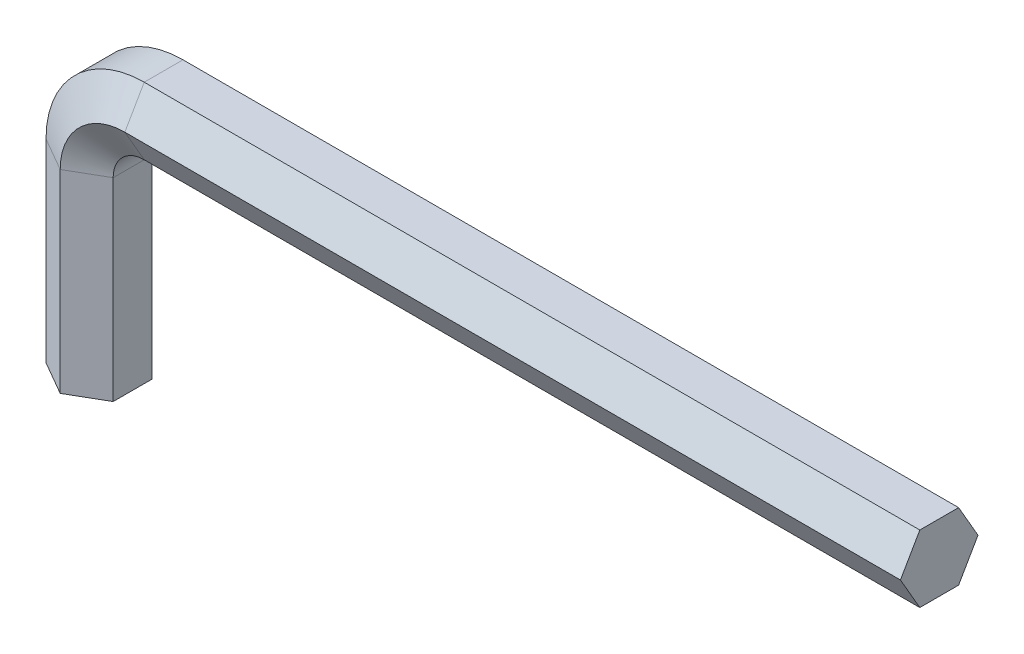
ISO-10303-21;
HEADER;
FILE_DESCRIPTION(('STEP AP214'),'2;1');
FILE_NAME('part.step','',(''),(''),'','','');
FILE_SCHEMA(('AUTOMOTIVE_DESIGN { 1 0 10303 214 1 1 1 1 }'));
ENDSEC;
DATA;
#1=APPLICATION_CONTEXT('core data for automotive mechanical design processes');
#2=APPLICATION_PROTOCOL_DEFINITION('international standard','automotive_design',2000,#1);
#3=PRODUCT_CONTEXT('',#1,'mechanical');
#4=PRODUCT('Part','Part','',(#3));
#5=PRODUCT_RELATED_PRODUCT_CATEGORY('part','',(#4));
#6=PRODUCT_DEFINITION_FORMATION('','',#4);
#7=PRODUCT_DEFINITION_CONTEXT('part definition',#1,'design');
#8=PRODUCT_DEFINITION('design','',#6,#7);
#9=PRODUCT_DEFINITION_SHAPE('','',#8);
#10=(LENGTH_UNIT() NAMED_UNIT(*) SI_UNIT(.MILLI.,.METRE.));
#11=(NAMED_UNIT(*) PLANE_ANGLE_UNIT() SI_UNIT($,.RADIAN.));
#12=(NAMED_UNIT(*) SI_UNIT($,.STERADIAN.) SOLID_ANGLE_UNIT());
#13=UNCERTAINTY_MEASURE_WITH_UNIT(LENGTH_MEASURE(1.E-05),#10,'distance_accuracy_value','');
#14=(GEOMETRIC_REPRESENTATION_CONTEXT(3) GLOBAL_UNCERTAINTY_ASSIGNED_CONTEXT((#13)) GLOBAL_UNIT_ASSIGNED_CONTEXT((#10,
#11,#12)) REPRESENTATION_CONTEXT('',''));
#15=CARTESIAN_POINT('',(0.,0.,0.));
#16=DIRECTION('',(0.,0.,1.));
#17=DIRECTION('',(1.,0.,0.));
#18=AXIS2_PLACEMENT_3D('',#15,#16,#17);
#19=CARTESIAN_POINT('',(65.,0.,0.));
#20=DIRECTION('',(-1.,0.,0.));
#21=DIRECTION('',(0.,0.,-1.));
#22=AXIS2_PLACEMENT_3D('',#19,#20,#21);
#23=PLANE('',#22);
#24=DIRECTION('',(0.,-0.866025403784442,-0.499999999999995));
#25=VECTOR('',#24,1.);
#26=CARTESIAN_POINT('',(65.,2.59807621135329,-1.50000000000003));
#27=LINE('',#26,#25);
#28=CARTESIAN_POINT('',(65.,2.59807621135329,-1.50000000000003));
#29=VERTEX_POINT('',#28);
#30=CARTESIAN_POINT('',(65.,0.,-2.99999999999999));
#31=VERTEX_POINT('',#30);
#32=EDGE_CURVE('E194',#29,#31,#27,.T.);
#33=ORIENTED_EDGE('',*,*,#32,.F.);
#34=DIRECTION('',(0.,0.,-1.));
#35=VECTOR('',#34,1.);
#36=CARTESIAN_POINT('',(65.,2.59807621135332,1.49999999999997));
#37=LINE('',#36,#35);
#38=CARTESIAN_POINT('',(65.,2.59807621135332,1.49999999999997));
#39=VERTEX_POINT('',#38);
#40=EDGE_CURVE('E256',#39,#29,#37,.T.);
#41=ORIENTED_EDGE('',*,*,#40,.F.);
#42=DIRECTION('',(0.,0.866025403784435,-0.500000000000007));
#43=VECTOR('',#42,1.);
#44=CARTESIAN_POINT('',(65.,0.,2.99999999999999));
#45=LINE('',#44,#43);
#46=CARTESIAN_POINT('',(65.,0.,2.99999999999999));
#47=VERTEX_POINT('',#46);
#48=EDGE_CURVE('E236',#47,#39,#45,.T.);
#49=ORIENTED_EDGE('',*,*,#48,.F.);
#50=DIRECTION('',(0.,0.866025403784442,0.499999999999995));
#51=VECTOR('',#50,1.);
#52=CARTESIAN_POINT('',(65.,-2.5980762113533,1.50000000000001));
#53=LINE('',#52,#51);
#54=CARTESIAN_POINT('',(65.,-2.5980762113533,1.50000000000001));
#55=VERTEX_POINT('',#54);
#56=EDGE_CURVE('E141',#55,#47,#53,.T.);
#57=ORIENTED_EDGE('',*,*,#56,.F.);
#58=DIRECTION('',(0.,0.,1.));
#59=VECTOR('',#58,1.);
#60=CARTESIAN_POINT('',(65.,-2.59807621135331,-1.49999999999999));
#61=LINE('',#60,#59);
#62=CARTESIAN_POINT('',(65.,-2.59807621135331,-1.49999999999999));
#63=VERTEX_POINT('',#62);
#64=EDGE_CURVE('E145',#63,#55,#61,.T.);
#65=ORIENTED_EDGE('',*,*,#64,.F.);
#66=DIRECTION('',(0.,-0.866025403784438,0.500000000000001));
#67=VECTOR('',#66,1.);
#68=CARTESIAN_POINT('',(65.,0.,-2.99999999999999));
#69=LINE('',#68,#67);
#70=EDGE_CURVE('E150',#31,#63,#69,.T.);
#71=ORIENTED_EDGE('',*,*,#70,.F.);
#72=EDGE_LOOP('',(#33,#41,#49,#57,#65,#71));
#73=FACE_BOUND('',#72,.T.);
#74=ADVANCED_FACE('F39',(#73),#23,.F.);
#75=CARTESIAN_POINT('',(0.,-20.,0.));
#76=DIRECTION('',(0.,-1.,0.));
#77=DIRECTION('',(0.,0.,-1.));
#78=AXIS2_PLACEMENT_3D('',#75,#76,#77);
#79=PLANE('',#78);
#80=DIRECTION('',(0.866025403784442,0.,-0.499999999999995));
#81=VECTOR('',#80,1.);
#82=CARTESIAN_POINT('',(-2.59807621135329,-20.,-1.50000000000003));
#83=LINE('',#82,#81);
#84=CARTESIAN_POINT('',(-2.59807621135329,-20.,-1.50000000000003));
#85=VERTEX_POINT('',#84);
#86=CARTESIAN_POINT('',(0.,-20.,-2.99999999999999));
#87=VERTEX_POINT('',#86);
#88=EDGE_CURVE('E161',#85,#87,#83,.T.);
#89=ORIENTED_EDGE('',*,*,#88,.T.);
#90=DIRECTION('',(0.866025403784438,0.,0.500000000000001));
#91=VECTOR('',#90,1.);
#92=CARTESIAN_POINT('',(0.,-20.,-2.99999999999999));
#93=LINE('',#92,#91);
#94=CARTESIAN_POINT('',(2.59807621135332,-20.,-1.49999999999999));
#95=VERTEX_POINT('',#94);
#96=EDGE_CURVE('E164',#87,#95,#93,.T.);
#97=ORIENTED_EDGE('',*,*,#96,.T.);
#98=DIRECTION('',(0.,0.,1.));
#99=VECTOR('',#98,1.);
#100=CARTESIAN_POINT('',(2.59807621135332,-20.,-1.49999999999999));
#101=LINE('',#100,#99);
#102=CARTESIAN_POINT('',(2.59807621135331,-20.,1.50000000000001));
#103=VERTEX_POINT('',#102);
#104=EDGE_CURVE('E214',#95,#103,#101,.T.);
#105=ORIENTED_EDGE('',*,*,#104,.T.);
#106=DIRECTION('',(-0.866025403784442,0.,0.499999999999995));
#107=VECTOR('',#106,1.);
#108=CARTESIAN_POINT('',(2.59807621135331,-20.,1.50000000000001));
#109=LINE('',#108,#107);
#110=CARTESIAN_POINT('',(0.,-20.,2.99999999999999));
#111=VERTEX_POINT('',#110);
#112=EDGE_CURVE('E59',#103,#111,#109,.T.);
#113=ORIENTED_EDGE('',*,*,#112,.T.);
#114=DIRECTION('',(-0.866025403784435,0.,-0.500000000000007));
#115=VECTOR('',#114,1.);
#116=CARTESIAN_POINT('',(0.,-20.,2.99999999999999));
#117=LINE('',#116,#115);
#118=CARTESIAN_POINT('',(-2.59807621135332,-20.,1.49999999999997));
#119=VERTEX_POINT('',#118);
#120=EDGE_CURVE('E53',#111,#119,#117,.T.);
#121=ORIENTED_EDGE('',*,*,#120,.T.);
#122=DIRECTION('',(0.,0.,-1.));
#123=VECTOR('',#122,1.);
#124=CARTESIAN_POINT('',(-2.59807621135332,-20.,1.49999999999997));
#125=LINE('',#124,#123);
#126=EDGE_CURVE('E11',#119,#85,#125,.T.);
#127=ORIENTED_EDGE('',*,*,#126,.T.);
#128=EDGE_LOOP('',(#89,#97,#105,#113,#121,#127));
#129=FACE_BOUND('',#128,.T.);
#130=ADVANCED_FACE('F163',(#129),#79,.T.);
#131=CARTESIAN_POINT('',(65.,2.59807621135329,-1.50000000000003));
#132=DIRECTION('',(0.,0.499999999999995,-0.866025403784442));
#133=DIRECTION('',(0.,0.866025403784442,0.499999999999995));
#134=AXIS2_PLACEMENT_3D('',#131,#132,#133);
#135=PLANE('',#134);
#136=DIRECTION('',(-1.,0.,0.));
#137=VECTOR('',#136,1.);
#138=CARTESIAN_POINT('',(65.,0.,-2.99999999999999));
#139=LINE('',#138,#137);
#140=CARTESIAN_POINT('',(5.00000000000003,0.,-2.99999999999999));
#141=VERTEX_POINT('',#140);
#142=EDGE_CURVE('E200',#31,#141,#139,.T.);
#143=ORIENTED_EDGE('',*,*,#142,.T.);
#144=DIRECTION('',(0.,-0.866025403784442,-0.499999999999995));
#145=VECTOR('',#144,1.);
#146=CARTESIAN_POINT('',(5.00000000000004,2.59807621135329,-1.50000000000003));
#147=LINE('',#146,#145);
#148=CARTESIAN_POINT('',(5.00000000000003,2.59807621135329,-1.50000000000003));
#149=VERTEX_POINT('',#148);
#150=EDGE_CURVE('E301',#149,#141,#147,.T.);
#151=ORIENTED_EDGE('',*,*,#150,.F.);
#152=DIRECTION('',(-1.,0.,0.));
#153=VECTOR('',#152,1.);
#154=CARTESIAN_POINT('',(65.,2.59807621135329,-1.50000000000003));
#155=LINE('',#154,#153);
#156=EDGE_CURVE('E277',#29,#149,#155,.T.);
#157=ORIENTED_EDGE('',*,*,#156,.F.);
#158=ORIENTED_EDGE('',*,*,#32,.T.);
#159=EDGE_LOOP('',(#143,#151,#157,#158));
#160=FACE_BOUND('',#159,.T.);
#161=ADVANCED_FACE('F311',(#160),#135,.T.);
#162=CARTESIAN_POINT('',(65.,0.,-2.99999999999999));
#163=DIRECTION('',(0.,-0.500000000000001,-0.866025403784438));
#164=DIRECTION('',(0.,0.866025403784438,-0.500000000000001));
#165=AXIS2_PLACEMENT_3D('',#162,#163,#164);
#166=PLANE('',#165);
#167=DIRECTION('',(-1.,0.,0.));
#168=VECTOR('',#167,1.);
#169=CARTESIAN_POINT('',(65.,-2.59807621135331,-1.49999999999999));
#170=LINE('',#169,#168);
#171=CARTESIAN_POINT('',(5.00000000000003,-2.59807621135331,-1.49999999999999));
#172=VERTEX_POINT('',#171);
#173=EDGE_CURVE('E199',#63,#172,#170,.T.);
#174=ORIENTED_EDGE('',*,*,#173,.T.);
#175=DIRECTION('',(0.,-0.866025403784438,0.500000000000001));
#176=VECTOR('',#175,1.);
#177=CARTESIAN_POINT('',(5.00000000000004,0.,-2.99999999999999));
#178=LINE('',#177,#176);
#179=EDGE_CURVE('E195',#141,#172,#178,.T.);
#180=ORIENTED_EDGE('',*,*,#179,.F.);
#181=ORIENTED_EDGE('',*,*,#142,.F.);
#182=ORIENTED_EDGE('',*,*,#70,.T.);
#183=EDGE_LOOP('',(#174,#180,#181,#182));
#184=FACE_BOUND('',#183,.T.);
#185=ADVANCED_FACE('F314',(#184),#166,.T.);
#186=CARTESIAN_POINT('',(65.,-2.59807621135331,-1.49999999999999));
#187=DIRECTION('',(0.,-1.,0.));
#188=DIRECTION('',(0.,0.,-1.));
#189=AXIS2_PLACEMENT_3D('',#186,#187,#188);
#190=PLANE('',#189);
#191=DIRECTION('',(-1.,0.,0.));
#192=VECTOR('',#191,1.);
#193=CARTESIAN_POINT('',(65.,-2.5980762113533,1.50000000000001));
#194=LINE('',#193,#192);
#195=CARTESIAN_POINT('',(5.00000000000003,-2.5980762113533,1.50000000000001));
#196=VERTEX_POINT('',#195);
#197=EDGE_CURVE('E219',#55,#196,#194,.T.);
#198=ORIENTED_EDGE('',*,*,#197,.T.);
#199=DIRECTION('',(0.,0.,1.));
#200=VECTOR('',#199,1.);
#201=CARTESIAN_POINT('',(5.00000000000004,-2.59807621135331,-1.49999999999999));
#202=LINE('',#201,#200);
#203=EDGE_CURVE('E204',#172,#196,#202,.T.);
#204=ORIENTED_EDGE('',*,*,#203,.F.);
#205=ORIENTED_EDGE('',*,*,#173,.F.);
#206=ORIENTED_EDGE('',*,*,#64,.T.);
#207=EDGE_LOOP('',(#198,#204,#205,#206));
#208=FACE_BOUND('',#207,.T.);
#209=ADVANCED_FACE('F368',(#208),#190,.T.);
#210=CARTESIAN_POINT('',(65.,-2.5980762113533,1.50000000000001));
#211=DIRECTION('',(0.,-0.499999999999995,0.866025403784441));
#212=DIRECTION('',(0.,-0.866025403784442,-0.499999999999995));
#213=AXIS2_PLACEMENT_3D('',#210,#211,#212);
#214=PLANE('',#213);
#215=DIRECTION('',(-1.,0.,0.));
#216=VECTOR('',#215,1.);
#217=CARTESIAN_POINT('',(65.,0.,2.99999999999999));
#218=LINE('',#217,#216);
#219=CARTESIAN_POINT('',(5.00000000000003,0.,2.99999999999999));
#220=VERTEX_POINT('',#219);
#221=EDGE_CURVE('E239',#47,#220,#218,.T.);
#222=ORIENTED_EDGE('',*,*,#221,.T.);
#223=DIRECTION('',(0.,0.866025403784442,0.499999999999995));
#224=VECTOR('',#223,1.);
#225=CARTESIAN_POINT('',(5.00000000000004,-2.5980762113533,1.50000000000001));
#226=LINE('',#225,#224);
#227=EDGE_CURVE('E223',#196,#220,#226,.T.);
#228=ORIENTED_EDGE('',*,*,#227,.F.);
#229=ORIENTED_EDGE('',*,*,#197,.F.);
#230=ORIENTED_EDGE('',*,*,#56,.T.);
#231=EDGE_LOOP('',(#222,#228,#229,#230));
#232=FACE_BOUND('',#231,.T.);
#233=ADVANCED_FACE('F376',(#232),#214,.T.);
#234=CARTESIAN_POINT('',(65.,0.,2.99999999999999));
#235=DIRECTION('',(0.,0.500000000000007,0.866025403784435));
#236=DIRECTION('',(0.,-0.866025403784435,0.500000000000007));
#237=AXIS2_PLACEMENT_3D('',#234,#235,#236);
#238=PLANE('',#237);
#239=DIRECTION('',(-1.,0.,0.));
#240=VECTOR('',#239,1.);
#241=CARTESIAN_POINT('',(65.,2.59807621135332,1.49999999999997));
#242=LINE('',#241,#240);
#243=CARTESIAN_POINT('',(5.00000000000003,2.59807621135332,1.49999999999997));
#244=VERTEX_POINT('',#243);
#245=EDGE_CURVE('E259',#39,#244,#242,.T.);
#246=ORIENTED_EDGE('',*,*,#245,.T.);
#247=DIRECTION('',(0.,0.866025403784435,-0.500000000000007));
#248=VECTOR('',#247,1.);
#249=CARTESIAN_POINT('',(5.00000000000004,0.,2.99999999999999));
#250=LINE('',#249,#248);
#251=EDGE_CURVE('E243',#220,#244,#250,.T.);
#252=ORIENTED_EDGE('',*,*,#251,.F.);
#253=ORIENTED_EDGE('',*,*,#221,.F.);
#254=ORIENTED_EDGE('',*,*,#48,.T.);
#255=EDGE_LOOP('',(#246,#252,#253,#254));
#256=FACE_BOUND('',#255,.T.);
#257=ADVANCED_FACE('F386',(#256),#238,.T.);
#258=CARTESIAN_POINT('',(65.,2.59807621135332,1.49999999999997));
#259=DIRECTION('',(0.,1.,0.));
#260=DIRECTION('',(0.,0.,1.));
#261=AXIS2_PLACEMENT_3D('',#258,#259,#260);
#262=PLANE('',#261);
#263=DIRECTION('',(0.,0.,-1.));
#264=VECTOR('',#263,1.);
#265=CARTESIAN_POINT('',(5.00000000000004,2.59807621135332,1.49999999999997));
#266=LINE('',#265,#264);
#267=EDGE_CURVE('E263',#244,#149,#266,.T.);
#268=ORIENTED_EDGE('',*,*,#267,.F.);
#269=ORIENTED_EDGE('',*,*,#245,.F.);
#270=ORIENTED_EDGE('',*,*,#40,.T.);
#271=ORIENTED_EDGE('',*,*,#156,.T.);
#272=EDGE_LOOP('',(#268,#269,#270,#271));
#273=FACE_BOUND('',#272,.T.);
#274=ADVANCED_FACE('F327',(#273),#262,.T.);
#275=CARTESIAN_POINT('',(5.,-5.,-1.50000000000003));
#276=DIRECTION('',(0.,0.,1.));
#277=DIRECTION('',(1.,0.,0.));
#278=AXIS2_PLACEMENT_3D('',#275,#276,#277);
#279=CONICAL_SURFACE('',#278,7.59807621135329,1.0471975511966);
#280=CARTESIAN_POINT('',(5.,-5.,-2.99999999999999));
#281=DIRECTION('',(0.,0.,1.));
#282=DIRECTION('',(0.,1.,0.));
#283=AXIS2_PLACEMENT_3D('',#280,#281,#282);
#284=CIRCLE('',#283,5.);
#285=CARTESIAN_POINT('',(0.,-5.00000000000003,-2.99999999999999));
#286=VERTEX_POINT('',#285);
#287=EDGE_CURVE('E208',#141,#286,#284,.T.);
#288=ORIENTED_EDGE('',*,*,#287,.T.);
#289=DIRECTION('',(0.866025403784442,0.,-0.499999999999995));
#290=VECTOR('',#289,1.);
#291=CARTESIAN_POINT('',(-2.59807621135342,-5.00000000000003,-1.50000000000003));
#292=LINE('',#291,#290);
#293=CARTESIAN_POINT('',(-2.59807621135329,-5.00000000000003,-1.50000000000003));
#294=VERTEX_POINT('',#293);
#295=EDGE_CURVE('E184',#294,#286,#292,.T.);
#296=ORIENTED_EDGE('',*,*,#295,.F.);
#297=CARTESIAN_POINT('',(5.,-5.,-1.50000000000003));
#298=DIRECTION('',(0.,0.,1.));
#299=DIRECTION('',(0.,1.,0.));
#300=AXIS2_PLACEMENT_3D('',#297,#298,#299);
#301=CIRCLE('',#300,7.59807621135329);
#302=EDGE_CURVE('E280',#149,#294,#301,.T.);
#303=ORIENTED_EDGE('',*,*,#302,.F.);
#304=ORIENTED_EDGE('',*,*,#150,.T.);
#305=EDGE_LOOP('',(#288,#296,#303,#304));
#306=FACE_BOUND('',#305,.T.);
#307=ADVANCED_FACE('F287',(#306),#279,.T.);
#308=CARTESIAN_POINT('',(5.,-5.,-2.99999999999999));
#309=DIRECTION('',(0.,0.,-1.));
#310=DIRECTION('',(-1.,0.,0.));
#311=AXIS2_PLACEMENT_3D('',#308,#309,#310);
#312=CONICAL_SURFACE('',#311,5.,1.0471975511966);
#313=CARTESIAN_POINT('',(5.,-5.,-1.49999999999999));
#314=DIRECTION('',(0.,0.,1.));
#315=DIRECTION('',(0.,1.,0.));
#316=AXIS2_PLACEMENT_3D('',#313,#314,#315);
#317=CIRCLE('',#316,2.40192378864669);
#318=CARTESIAN_POINT('',(2.59807621135331,-5.00000000000003,-1.49999999999999));
#319=VERTEX_POINT('',#318);
#320=EDGE_CURVE('E128',#172,#319,#317,.T.);
#321=ORIENTED_EDGE('',*,*,#320,.T.);
#322=DIRECTION('',(0.866025403784438,0.,0.500000000000001));
#323=VECTOR('',#322,1.);
#324=CARTESIAN_POINT('',(-1.2906572496469E-13,-5.00000000000003,-2.99999999999999));
#325=LINE('',#324,#323);
#326=EDGE_CURVE('E205',#286,#319,#325,.T.);
#327=ORIENTED_EDGE('',*,*,#326,.F.);
#328=ORIENTED_EDGE('',*,*,#287,.F.);
#329=ORIENTED_EDGE('',*,*,#179,.T.);
#330=EDGE_LOOP('',(#321,#327,#328,#329));
#331=FACE_BOUND('',#330,.T.);
#332=ADVANCED_FACE('F317',(#331),#312,.F.);
#333=CARTESIAN_POINT('',(5.,-5.,0.));
#334=DIRECTION('',(0.,0.,1.));
#335=DIRECTION('',(1.,0.,0.));
#336=AXIS2_PLACEMENT_3D('',#333,#334,#335);
#337=CYLINDRICAL_SURFACE('',#336,2.40192378864669);
#338=CARTESIAN_POINT('',(5.,-5.,1.50000000000001));
#339=DIRECTION('',(0.,0.,1.));
#340=DIRECTION('',(0.,1.,0.));
#341=AXIS2_PLACEMENT_3D('',#338,#339,#340);
#342=CIRCLE('',#341,2.4019237886467);
#343=CARTESIAN_POINT('',(2.5980762113533,-5.00000000000003,1.50000000000001));
#344=VERTEX_POINT('',#343);
#345=EDGE_CURVE('E119',#196,#344,#342,.T.);
#346=ORIENTED_EDGE('',*,*,#345,.T.);
#347=DIRECTION('',(0.,0.,1.));
#348=VECTOR('',#347,1.);
#349=CARTESIAN_POINT('',(2.59807621135319,-5.00000000000003,-1.49999999999999));
#350=LINE('',#349,#348);
#351=EDGE_CURVE('E210',#319,#344,#350,.T.);
#352=ORIENTED_EDGE('',*,*,#351,.F.);
#353=ORIENTED_EDGE('',*,*,#320,.F.);
#354=ORIENTED_EDGE('',*,*,#203,.T.);
#355=EDGE_LOOP('',(#346,#352,#353,#354));
#356=FACE_BOUND('',#355,.T.);
#357=ADVANCED_FACE('F319',(#356),#337,.F.);
#358=CARTESIAN_POINT('',(5.,-5.,1.50000000000001));
#359=DIRECTION('',(0.,0.,1.));
#360=DIRECTION('',(1.,0.,0.));
#361=AXIS2_PLACEMENT_3D('',#358,#359,#360);
#362=CONICAL_SURFACE('',#361,2.4019237886467,1.0471975511966);
#363=CARTESIAN_POINT('',(5.,-5.,2.99999999999999));
#364=DIRECTION('',(0.,0.,1.));
#365=DIRECTION('',(0.,1.,0.));
#366=AXIS2_PLACEMENT_3D('',#363,#364,#365);
#367=CIRCLE('',#366,5.00000000000002);
#368=CARTESIAN_POINT('',(0.,-5.00000000000003,2.99999999999999));
#369=VERTEX_POINT('',#368);
#370=EDGE_CURVE('E112',#220,#369,#367,.T.);
#371=ORIENTED_EDGE('',*,*,#370,.T.);
#372=DIRECTION('',(-0.866025403784442,0.,0.499999999999995));
#373=VECTOR('',#372,1.);
#374=CARTESIAN_POINT('',(2.59807621135317,-5.00000000000003,1.50000000000001));
#375=LINE('',#374,#373);
#376=EDGE_CURVE('E229',#344,#369,#375,.T.);
#377=ORIENTED_EDGE('',*,*,#376,.F.);
#378=ORIENTED_EDGE('',*,*,#345,.F.);
#379=ORIENTED_EDGE('',*,*,#227,.T.);
#380=EDGE_LOOP('',(#371,#377,#378,#379));
#381=FACE_BOUND('',#380,.T.);
#382=ADVANCED_FACE('F325',(#381),#362,.F.);
#383=CARTESIAN_POINT('',(5.,-5.,2.99999999999999));
#384=DIRECTION('',(0.,0.,-1.));
#385=DIRECTION('',(-1.,0.,0.));
#386=AXIS2_PLACEMENT_3D('',#383,#384,#385);
#387=CONICAL_SURFACE('',#386,5.00000000000002,1.04719755119659);
#388=CARTESIAN_POINT('',(5.,-5.,1.49999999999997));
#389=DIRECTION('',(0.,0.,1.));
#390=DIRECTION('',(0.,1.,0.));
#391=AXIS2_PLACEMENT_3D('',#388,#389,#390);
#392=CIRCLE('',#391,7.59807621135332);
#393=CARTESIAN_POINT('',(-2.59807621135332,-5.00000000000003,1.49999999999997));
#394=VERTEX_POINT('',#393);
#395=EDGE_CURVE('E266',#244,#394,#392,.T.);
#396=ORIENTED_EDGE('',*,*,#395,.T.);
#397=DIRECTION('',(-0.866025403784435,0.,-0.500000000000007));
#398=VECTOR('',#397,1.);
#399=CARTESIAN_POINT('',(-1.50011999787904E-13,-5.00000000000003,2.99999999999999));
#400=LINE('',#399,#398);
#401=EDGE_CURVE('E248',#369,#394,#400,.T.);
#402=ORIENTED_EDGE('',*,*,#401,.F.);
#403=ORIENTED_EDGE('',*,*,#370,.F.);
#404=ORIENTED_EDGE('',*,*,#251,.T.);
#405=EDGE_LOOP('',(#396,#402,#403,#404));
#406=FACE_BOUND('',#405,.T.);
#407=ADVANCED_FACE('F429',(#406),#387,.T.);
#408=CARTESIAN_POINT('',(5.,-5.,0.));
#409=DIRECTION('',(0.,0.,1.));
#410=DIRECTION('',(1.,0.,0.));
#411=AXIS2_PLACEMENT_3D('',#408,#409,#410);
#412=CYLINDRICAL_SURFACE('',#411,7.59807621135331);
#413=DIRECTION('',(0.,0.,-1.));
#414=VECTOR('',#413,1.);
#415=CARTESIAN_POINT('',(-2.59807621135345,-5.00000000000003,1.49999999999997));
#416=LINE('',#415,#414);
#417=EDGE_CURVE('E191',#394,#294,#416,.T.);
#418=ORIENTED_EDGE('',*,*,#417,.F.);
#419=ORIENTED_EDGE('',*,*,#395,.F.);
#420=ORIENTED_EDGE('',*,*,#267,.T.);
#421=ORIENTED_EDGE('',*,*,#302,.T.);
#422=EDGE_LOOP('',(#418,#419,#420,#421));
#423=FACE_BOUND('',#422,.T.);
#424=ADVANCED_FACE('F291',(#423),#412,.T.);
#425=CARTESIAN_POINT('',(-2.59807621135329,-5.00000000000003,-1.50000000000003));
#426=DIRECTION('',(-0.499999999999995,0.,-0.866025403784442));
#427=DIRECTION('',(-0.866025403784442,0.,0.499999999999995));
#428=AXIS2_PLACEMENT_3D('',#425,#426,#427);
#429=PLANE('',#428);
#430=DIRECTION('',(0.,-1.,0.));
#431=VECTOR('',#430,1.);
#432=CARTESIAN_POINT('',(0.,-5.00000000000003,-2.99999999999999));
#433=LINE('',#432,#431);
#434=EDGE_CURVE('E170',#286,#87,#433,.T.);
#435=ORIENTED_EDGE('',*,*,#434,.T.);
#436=ORIENTED_EDGE('',*,*,#88,.F.);
#437=DIRECTION('',(0.,-1.,0.));
#438=VECTOR('',#437,1.);
#439=CARTESIAN_POINT('',(-2.59807621135329,-5.00000000000003,-1.50000000000003));
#440=LINE('',#439,#438);
#441=EDGE_CURVE('E171',#294,#85,#440,.T.);
#442=ORIENTED_EDGE('',*,*,#441,.F.);
#443=ORIENTED_EDGE('',*,*,#295,.T.);
#444=EDGE_LOOP('',(#435,#436,#442,#443));
#445=FACE_BOUND('',#444,.T.);
#446=ADVANCED_FACE('F182',(#445),#429,.T.);
#447=CARTESIAN_POINT('',(0.,-5.00000000000003,-2.99999999999999));
#448=DIRECTION('',(0.500000000000001,0.,-0.866025403784438));
#449=DIRECTION('',(-0.866025403784438,0.,-0.500000000000001));
#450=AXIS2_PLACEMENT_3D('',#447,#448,#449);
#451=PLANE('',#450);
#452=DIRECTION('',(0.,-1.,0.));
#453=VECTOR('',#452,1.);
#454=CARTESIAN_POINT('',(2.59807621135331,-5.00000000000003,-1.49999999999999));
#455=LINE('',#454,#453);
#456=EDGE_CURVE('E178',#319,#95,#455,.T.);
#457=ORIENTED_EDGE('',*,*,#456,.T.);
#458=ORIENTED_EDGE('',*,*,#96,.F.);
#459=ORIENTED_EDGE('',*,*,#434,.F.);
#460=ORIENTED_EDGE('',*,*,#326,.T.);
#461=EDGE_LOOP('',(#457,#458,#459,#460));
#462=FACE_BOUND('',#461,.T.);
#463=ADVANCED_FACE('F175',(#462),#451,.T.);
#464=CARTESIAN_POINT('',(2.59807621135331,-5.00000000000003,-1.49999999999999));
#465=DIRECTION('',(1.,0.,0.));
#466=DIRECTION('',(0.,0.,-1.));
#467=AXIS2_PLACEMENT_3D('',#464,#465,#466);
#468=PLANE('',#467);
#469=DIRECTION('',(0.,-1.,0.));
#470=VECTOR('',#469,1.);
#471=CARTESIAN_POINT('',(2.5980762113533,-5.00000000000003,1.50000000000001));
#472=LINE('',#471,#470);
#473=EDGE_CURVE('E97',#344,#103,#472,.T.);
#474=ORIENTED_EDGE('',*,*,#473,.T.);
#475=ORIENTED_EDGE('',*,*,#104,.F.);
#476=ORIENTED_EDGE('',*,*,#456,.F.);
#477=ORIENTED_EDGE('',*,*,#351,.T.);
#478=EDGE_LOOP('',(#474,#475,#476,#477));
#479=FACE_BOUND('',#478,.T.);
#480=ADVANCED_FACE('F461',(#479),#468,.T.);
#481=CARTESIAN_POINT('',(2.5980762113533,-5.00000000000003,1.50000000000001));
#482=DIRECTION('',(0.499999999999995,0.,0.866025403784442));
#483=DIRECTION('',(0.866025403784442,0.,-0.499999999999995));
#484=AXIS2_PLACEMENT_3D('',#481,#482,#483);
#485=PLANE('',#484);
#486=DIRECTION('',(0.,-1.,0.));
#487=VECTOR('',#486,1.);
#488=CARTESIAN_POINT('',(0.,-5.00000000000003,2.99999999999999));
#489=LINE('',#488,#487);
#490=EDGE_CURVE('E89',#369,#111,#489,.T.);
#491=ORIENTED_EDGE('',*,*,#490,.T.);
#492=ORIENTED_EDGE('',*,*,#112,.F.);
#493=ORIENTED_EDGE('',*,*,#473,.F.);
#494=ORIENTED_EDGE('',*,*,#376,.T.);
#495=EDGE_LOOP('',(#491,#492,#493,#494));
#496=FACE_BOUND('',#495,.T.);
#497=ADVANCED_FACE('F337',(#496),#485,.T.);
#498=CARTESIAN_POINT('',(0.,-5.00000000000003,2.99999999999999));
#499=DIRECTION('',(-0.500000000000007,0.,0.866025403784435));
#500=DIRECTION('',(0.866025403784435,0.,0.500000000000007));
#501=AXIS2_PLACEMENT_3D('',#498,#499,#500);
#502=PLANE('',#501);
#503=DIRECTION('',(0.,-1.,0.));
#504=VECTOR('',#503,1.);
#505=CARTESIAN_POINT('',(-2.59807621135332,-5.00000000000003,1.49999999999997));
#506=LINE('',#505,#504);
#507=EDGE_CURVE('E47',#394,#119,#506,.T.);
#508=ORIENTED_EDGE('',*,*,#507,.T.);
#509=ORIENTED_EDGE('',*,*,#120,.F.);
#510=ORIENTED_EDGE('',*,*,#490,.F.);
#511=ORIENTED_EDGE('',*,*,#401,.T.);
#512=EDGE_LOOP('',(#508,#509,#510,#511));
#513=FACE_BOUND('',#512,.T.);
#514=ADVANCED_FACE('F332',(#513),#502,.T.);
#515=CARTESIAN_POINT('',(-2.59807621135332,-5.00000000000003,1.49999999999997));
#516=DIRECTION('',(-1.,0.,0.));
#517=DIRECTION('',(0.,0.,1.));
#518=AXIS2_PLACEMENT_3D('',#515,#516,#517);
#519=PLANE('',#518);
#520=ORIENTED_EDGE('',*,*,#126,.F.);
#521=ORIENTED_EDGE('',*,*,#507,.F.);
#522=ORIENTED_EDGE('',*,*,#417,.T.);
#523=ORIENTED_EDGE('',*,*,#441,.T.);
#524=EDGE_LOOP('',(#520,#521,#522,#523));
#525=FACE_BOUND('',#524,.T.);
#526=ADVANCED_FACE('F282',(#525),#519,.T.);
#527=CLOSED_SHELL('',(#74,#130,#161,#185,#209,#233,#257,#274,#307,#332,#357,#382,#407,#424,#446,
#463,#480,#497,#514,#526));
#528=MANIFOLD_SOLID_BREP('B2',#527);
#529=ADVANCED_BREP_SHAPE_REPRESENTATION('',(#18,#528),#14);
#530=SHAPE_DEFINITION_REPRESENTATION(#9,#529);
ENDSEC;
END-ISO-10303-21;
